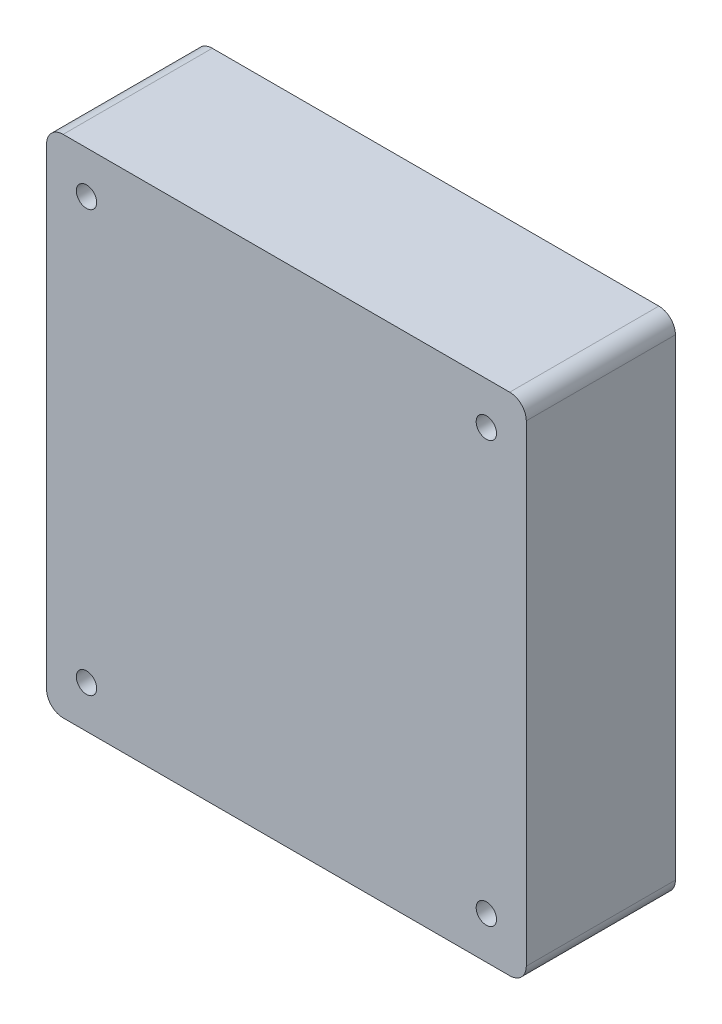
ISO-10303-21;
HEADER;
FILE_DESCRIPTION(('STEP AP214'),'2;1');
FILE_NAME('part.step','',(''),(''),'','','');
FILE_SCHEMA(('AUTOMOTIVE_DESIGN { 1 0 10303 214 1 1 1 1 }'));
ENDSEC;
DATA;
#1=APPLICATION_CONTEXT('core data for automotive mechanical design processes');
#2=APPLICATION_PROTOCOL_DEFINITION('international standard','automotive_design',2000,#1);
#3=PRODUCT_CONTEXT('',#1,'mechanical');
#4=PRODUCT('Part','Part','',(#3));
#5=PRODUCT_RELATED_PRODUCT_CATEGORY('part','',(#4));
#6=PRODUCT_DEFINITION_FORMATION('','',#4);
#7=PRODUCT_DEFINITION_CONTEXT('part definition',#1,'design');
#8=PRODUCT_DEFINITION('design','',#6,#7);
#9=PRODUCT_DEFINITION_SHAPE('','',#8);
#10=(LENGTH_UNIT() NAMED_UNIT(*) SI_UNIT(.MILLI.,.METRE.));
#11=(NAMED_UNIT(*) PLANE_ANGLE_UNIT() SI_UNIT($,.RADIAN.));
#12=(NAMED_UNIT(*) SI_UNIT($,.STERADIAN.) SOLID_ANGLE_UNIT());
#13=UNCERTAINTY_MEASURE_WITH_UNIT(LENGTH_MEASURE(1.E-05),#10,'distance_accuracy_value','');
#14=(GEOMETRIC_REPRESENTATION_CONTEXT(3) GLOBAL_UNCERTAINTY_ASSIGNED_CONTEXT((#13)) GLOBAL_UNIT_ASSIGNED_CONTEXT((#10,
#11,#12)) REPRESENTATION_CONTEXT('',''));
#15=CARTESIAN_POINT('',(0.,0.,0.));
#16=DIRECTION('',(0.,0.,1.));
#17=DIRECTION('',(1.,0.,0.));
#18=AXIS2_PLACEMENT_3D('',#15,#16,#17);
#19=CARTESIAN_POINT('',(28.95,30.5,18.));
#20=DIRECTION('',(0.,0.,1.));
#21=DIRECTION('',(1.,0.,0.));
#22=AXIS2_PLACEMENT_3D('',#19,#20,#21);
#23=PLANE('',#22);
#24=CARTESIAN_POINT('',(4.82,5.1,18.));
#25=DIRECTION('',(0.,0.,1.));
#26=DIRECTION('',(1.,0.,0.));
#27=AXIS2_PLACEMENT_3D('',#24,#25,#26);
#28=CIRCLE('',#27,1.2295);
#29=CARTESIAN_POINT('',(6.0495,5.1,18.));
#30=VERTEX_POINT('',#29);
#31=EDGE_CURVE('E137',#30,#30,#28,.F.);
#32=ORIENTED_EDGE('',*,*,#31,.T.);
#33=EDGE_LOOP('',(#32));
#34=FACE_BOUND('',#33,.T.);
#35=CARTESIAN_POINT('',(4.81999999999999,55.9,18.));
#36=DIRECTION('',(0.,0.,1.));
#37=DIRECTION('',(1.,0.,0.));
#38=AXIS2_PLACEMENT_3D('',#35,#36,#37);
#39=CIRCLE('',#38,1.2295);
#40=CARTESIAN_POINT('',(6.04949999999999,55.9,18.));
#41=VERTEX_POINT('',#40);
#42=EDGE_CURVE('E140',#41,#41,#39,.F.);
#43=ORIENTED_EDGE('',*,*,#42,.T.);
#44=EDGE_LOOP('',(#43));
#45=FACE_BOUND('',#44,.T.);
#46=CARTESIAN_POINT('',(53.08,5.1,18.));
#47=DIRECTION('',(0.,0.,1.));
#48=DIRECTION('',(1.,0.,0.));
#49=AXIS2_PLACEMENT_3D('',#46,#47,#48);
#50=CIRCLE('',#49,1.2295);
#51=CARTESIAN_POINT('',(54.3095,5.1,18.));
#52=VERTEX_POINT('',#51);
#53=EDGE_CURVE('E143',#52,#52,#50,.F.);
#54=ORIENTED_EDGE('',*,*,#53,.T.);
#55=EDGE_LOOP('',(#54));
#56=FACE_BOUND('',#55,.T.);
#57=CARTESIAN_POINT('',(53.08,55.9,18.));
#58=DIRECTION('',(0.,0.,1.));
#59=DIRECTION('',(1.,0.,0.));
#60=AXIS2_PLACEMENT_3D('',#57,#58,#59);
#61=CIRCLE('',#60,1.2295);
#62=CARTESIAN_POINT('',(54.3095,55.9,18.));
#63=VERTEX_POINT('',#62);
#64=EDGE_CURVE('E146',#63,#63,#61,.F.);
#65=ORIENTED_EDGE('',*,*,#64,.T.);
#66=EDGE_LOOP('',(#65));
#67=FACE_BOUND('',#66,.T.);
#68=CARTESIAN_POINT('',(55.9,2.,18.));
#69=DIRECTION('',(0.,0.,1.));
#70=DIRECTION('',(1.,0.,0.));
#71=AXIS2_PLACEMENT_3D('',#68,#69,#70);
#72=CIRCLE('',#71,2.);
#73=CARTESIAN_POINT('',(57.9,2.,18.));
#74=VERTEX_POINT('',#73);
#75=CARTESIAN_POINT('',(55.9,0.,18.));
#76=VERTEX_POINT('',#75);
#77=EDGE_CURVE('E151',#74,#76,#72,.F.);
#78=ORIENTED_EDGE('',*,*,#77,.F.);
#79=DIRECTION('',(0.,1.,0.));
#80=VECTOR('',#79,1.);
#81=CARTESIAN_POINT('',(57.9,61.,18.));
#82=LINE('',#81,#80);
#83=CARTESIAN_POINT('',(57.9,59.,18.));
#84=VERTEX_POINT('',#83);
#85=EDGE_CURVE('E106',#84,#74,#82,.F.);
#86=ORIENTED_EDGE('',*,*,#85,.F.);
#87=CARTESIAN_POINT('',(55.9,59.,18.));
#88=DIRECTION('',(0.,0.,1.));
#89=DIRECTION('',(1.,0.,0.));
#90=AXIS2_PLACEMENT_3D('',#87,#88,#89);
#91=CIRCLE('',#90,2.);
#92=CARTESIAN_POINT('',(55.9,61.,18.));
#93=VERTEX_POINT('',#92);
#94=EDGE_CURVE('E93',#93,#84,#91,.F.);
#95=ORIENTED_EDGE('',*,*,#94,.F.);
#96=DIRECTION('',(1.,0.,0.));
#97=VECTOR('',#96,1.);
#98=CARTESIAN_POINT('',(0.,61.,18.));
#99=LINE('',#98,#97);
#100=CARTESIAN_POINT('',(1.99999999999998,61.,18.));
#101=VERTEX_POINT('',#100);
#102=EDGE_CURVE('E89',#101,#93,#99,.T.);
#103=ORIENTED_EDGE('',*,*,#102,.F.);
#104=CARTESIAN_POINT('',(1.99999999999998,59.,18.));
#105=DIRECTION('',(0.,0.,1.));
#106=DIRECTION('',(1.,0.,0.));
#107=AXIS2_PLACEMENT_3D('',#104,#105,#106);
#108=CIRCLE('',#107,2.);
#109=CARTESIAN_POINT('',(0.,59.,18.));
#110=VERTEX_POINT('',#109);
#111=EDGE_CURVE('E20',#110,#101,#108,.F.);
#112=ORIENTED_EDGE('',*,*,#111,.F.);
#113=DIRECTION('',(0.,1.,0.));
#114=VECTOR('',#113,1.);
#115=CARTESIAN_POINT('',(0.,0.,18.));
#116=LINE('',#115,#114);
#117=CARTESIAN_POINT('',(0.,2.,18.));
#118=VERTEX_POINT('',#117);
#119=EDGE_CURVE('E102',#118,#110,#116,.T.);
#120=ORIENTED_EDGE('',*,*,#119,.F.);
#121=CARTESIAN_POINT('',(2.,2.,18.));
#122=DIRECTION('',(0.,0.,1.));
#123=DIRECTION('',(1.,0.,0.));
#124=AXIS2_PLACEMENT_3D('',#121,#122,#123);
#125=CIRCLE('',#124,2.);
#126=CARTESIAN_POINT('',(2.,0.,18.));
#127=VERTEX_POINT('',#126);
#128=EDGE_CURVE('E114',#127,#118,#125,.F.);
#129=ORIENTED_EDGE('',*,*,#128,.F.);
#130=DIRECTION('',(1.,0.,0.));
#131=VECTOR('',#130,1.);
#132=CARTESIAN_POINT('',(57.9,0.,18.));
#133=LINE('',#132,#131);
#134=EDGE_CURVE('E110',#76,#127,#133,.F.);
#135=ORIENTED_EDGE('',*,*,#134,.F.);
#136=EDGE_LOOP('',(#78,#86,#95,#103,#112,#120,#129,#135));
#137=FACE_BOUND('',#136,.T.);
#138=ADVANCED_FACE('F17',(#34,#45,#56,#67,#137),#23,.T.);
#139=CARTESIAN_POINT('',(0.,61.,0.));
#140=DIRECTION('',(0.,1.,0.));
#141=DIRECTION('',(0.,0.,1.));
#142=AXIS2_PLACEMENT_3D('',#139,#140,#141);
#143=PLANE('',#142);
#144=DIRECTION('',(0.,0.,1.));
#145=VECTOR('',#144,1.);
#146=CARTESIAN_POINT('',(1.99999999999998,61.,0.));
#147=LINE('',#146,#145);
#148=CARTESIAN_POINT('',(1.99999999999998,61.,0.));
#149=VERTEX_POINT('',#148);
#150=EDGE_CURVE('E86',#101,#149,#147,.F.);
#151=ORIENTED_EDGE('',*,*,#150,.F.);
#152=ORIENTED_EDGE('',*,*,#102,.T.);
#153=DIRECTION('',(0.,0.,1.));
#154=VECTOR('',#153,1.);
#155=CARTESIAN_POINT('',(55.9,61.,0.));
#156=LINE('',#155,#154);
#157=CARTESIAN_POINT('',(55.9,61.,0.));
#158=VERTEX_POINT('',#157);
#159=EDGE_CURVE('E149',#158,#93,#156,.T.);
#160=ORIENTED_EDGE('',*,*,#159,.F.);
#161=DIRECTION('',(1.,0.,0.));
#162=VECTOR('',#161,1.);
#163=CARTESIAN_POINT('',(28.95,61.,0.));
#164=LINE('',#163,#162);
#165=EDGE_CURVE('E100',#158,#149,#164,.F.);
#166=ORIENTED_EDGE('',*,*,#165,.T.);
#167=EDGE_LOOP('',(#151,#152,#160,#166));
#168=FACE_BOUND('',#167,.T.);
#169=ADVANCED_FACE('F99',(#168),#143,.T.);
#170=CARTESIAN_POINT('',(1.99999999999998,59.,0.));
#171=DIRECTION('',(0.,0.,1.));
#172=DIRECTION('',(1.,0.,0.));
#173=AXIS2_PLACEMENT_3D('',#170,#171,#172);
#174=CYLINDRICAL_SURFACE('',#173,2.);
#175=CARTESIAN_POINT('',(1.99999999999998,59.,0.));
#176=DIRECTION('',(0.,0.,1.));
#177=DIRECTION('',(1.,0.,0.));
#178=AXIS2_PLACEMENT_3D('',#175,#176,#177);
#179=CIRCLE('',#178,2.);
#180=CARTESIAN_POINT('',(0.,59.,0.));
#181=VERTEX_POINT('',#180);
#182=EDGE_CURVE('E135',#149,#181,#179,.T.);
#183=ORIENTED_EDGE('',*,*,#182,.T.);
#184=DIRECTION('',(0.,0.,1.));
#185=VECTOR('',#184,1.);
#186=CARTESIAN_POINT('',(0.,59.,0.));
#187=LINE('',#186,#185);
#188=EDGE_CURVE('E88',#110,#181,#187,.F.);
#189=ORIENTED_EDGE('',*,*,#188,.F.);
#190=ORIENTED_EDGE('',*,*,#111,.T.);
#191=ORIENTED_EDGE('',*,*,#150,.T.);
#192=EDGE_LOOP('',(#183,#189,#190,#191));
#193=FACE_BOUND('',#192,.T.);
#194=ADVANCED_FACE('F84',(#193),#174,.T.);
#195=CARTESIAN_POINT('',(0.,0.,0.));
#196=DIRECTION('',(-1.,0.,0.));
#197=DIRECTION('',(0.,0.,1.));
#198=AXIS2_PLACEMENT_3D('',#195,#196,#197);
#199=PLANE('',#198);
#200=DIRECTION('',(0.,0.,1.));
#201=VECTOR('',#200,1.);
#202=CARTESIAN_POINT('',(0.,2.,0.));
#203=LINE('',#202,#201);
#204=CARTESIAN_POINT('',(0.,2.,0.));
#205=VERTEX_POINT('',#204);
#206=EDGE_CURVE('E113',#118,#205,#203,.F.);
#207=ORIENTED_EDGE('',*,*,#206,.F.);
#208=ORIENTED_EDGE('',*,*,#119,.T.);
#209=ORIENTED_EDGE('',*,*,#188,.T.);
#210=DIRECTION('',(0.,1.,0.));
#211=VECTOR('',#210,1.);
#212=CARTESIAN_POINT('',(0.,30.5,0.));
#213=LINE('',#212,#211);
#214=EDGE_CURVE('E134',#181,#205,#213,.F.);
#215=ORIENTED_EDGE('',*,*,#214,.T.);
#216=EDGE_LOOP('',(#207,#208,#209,#215));
#217=FACE_BOUND('',#216,.T.);
#218=ADVANCED_FACE('F186',(#217),#199,.T.);
#219=CARTESIAN_POINT('',(2.,2.,0.));
#220=DIRECTION('',(0.,0.,1.));
#221=DIRECTION('',(1.,0.,0.));
#222=AXIS2_PLACEMENT_3D('',#219,#220,#221);
#223=CYLINDRICAL_SURFACE('',#222,2.);
#224=CARTESIAN_POINT('',(2.,2.,0.));
#225=DIRECTION('',(0.,0.,1.));
#226=DIRECTION('',(1.,0.,0.));
#227=AXIS2_PLACEMENT_3D('',#224,#225,#226);
#228=CIRCLE('',#227,2.);
#229=CARTESIAN_POINT('',(2.,0.,0.));
#230=VERTEX_POINT('',#229);
#231=EDGE_CURVE('E131',#205,#230,#228,.T.);
#232=ORIENTED_EDGE('',*,*,#231,.T.);
#233=DIRECTION('',(0.,0.,-1.));
#234=VECTOR('',#233,1.);
#235=CARTESIAN_POINT('',(2.,0.,0.));
#236=LINE('',#235,#234);
#237=EDGE_CURVE('E112',#127,#230,#236,.T.);
#238=ORIENTED_EDGE('',*,*,#237,.F.);
#239=ORIENTED_EDGE('',*,*,#128,.T.);
#240=ORIENTED_EDGE('',*,*,#206,.T.);
#241=EDGE_LOOP('',(#232,#238,#239,#240));
#242=FACE_BOUND('',#241,.T.);
#243=ADVANCED_FACE('F184',(#242),#223,.T.);
#244=CARTESIAN_POINT('',(57.9,0.,0.));
#245=DIRECTION('',(0.,-1.,0.));
#246=DIRECTION('',(0.,0.,-1.));
#247=AXIS2_PLACEMENT_3D('',#244,#245,#246);
#248=PLANE('',#247);
#249=ORIENTED_EDGE('',*,*,#237,.T.);
#250=DIRECTION('',(1.,0.,0.));
#251=VECTOR('',#250,1.);
#252=CARTESIAN_POINT('',(28.95,0.,0.));
#253=LINE('',#252,#251);
#254=CARTESIAN_POINT('',(55.9,0.,0.));
#255=VERTEX_POINT('',#254);
#256=EDGE_CURVE('E130',#230,#255,#253,.T.);
#257=ORIENTED_EDGE('',*,*,#256,.T.);
#258=DIRECTION('',(0.,0.,1.));
#259=VECTOR('',#258,1.);
#260=CARTESIAN_POINT('',(55.9,0.,0.));
#261=LINE('',#260,#259);
#262=EDGE_CURVE('E109',#76,#255,#261,.F.);
#263=ORIENTED_EDGE('',*,*,#262,.F.);
#264=ORIENTED_EDGE('',*,*,#134,.T.);
#265=EDGE_LOOP('',(#249,#257,#263,#264));
#266=FACE_BOUND('',#265,.T.);
#267=ADVANCED_FACE('F182',(#266),#248,.T.);
#268=CARTESIAN_POINT('',(55.9,2.,0.));
#269=DIRECTION('',(0.,0.,1.));
#270=DIRECTION('',(1.,0.,0.));
#271=AXIS2_PLACEMENT_3D('',#268,#269,#270);
#272=CYLINDRICAL_SURFACE('',#271,2.);
#273=CARTESIAN_POINT('',(55.9,2.,0.));
#274=DIRECTION('',(0.,0.,1.));
#275=DIRECTION('',(1.,0.,0.));
#276=AXIS2_PLACEMENT_3D('',#273,#274,#275);
#277=CIRCLE('',#276,2.);
#278=CARTESIAN_POINT('',(57.9,2.,0.));
#279=VERTEX_POINT('',#278);
#280=EDGE_CURVE('E127',#255,#279,#277,.T.);
#281=ORIENTED_EDGE('',*,*,#280,.T.);
#282=DIRECTION('',(0.,0.,-1.));
#283=VECTOR('',#282,1.);
#284=CARTESIAN_POINT('',(57.9,2.,0.));
#285=LINE('',#284,#283);
#286=EDGE_CURVE('E108',#74,#279,#285,.T.);
#287=ORIENTED_EDGE('',*,*,#286,.F.);
#288=ORIENTED_EDGE('',*,*,#77,.T.);
#289=ORIENTED_EDGE('',*,*,#262,.T.);
#290=EDGE_LOOP('',(#281,#287,#288,#289));
#291=FACE_BOUND('',#290,.T.);
#292=ADVANCED_FACE('F178',(#291),#272,.T.);
#293=CARTESIAN_POINT('',(57.9,61.,0.));
#294=DIRECTION('',(1.,0.,0.));
#295=DIRECTION('',(0.,0.,-1.));
#296=AXIS2_PLACEMENT_3D('',#293,#294,#295);
#297=PLANE('',#296);
#298=ORIENTED_EDGE('',*,*,#286,.T.);
#299=DIRECTION('',(0.,1.,0.));
#300=VECTOR('',#299,1.);
#301=CARTESIAN_POINT('',(57.9,30.5,0.));
#302=LINE('',#301,#300);
#303=CARTESIAN_POINT('',(57.9,59.,0.));
#304=VERTEX_POINT('',#303);
#305=EDGE_CURVE('E126',#279,#304,#302,.T.);
#306=ORIENTED_EDGE('',*,*,#305,.T.);
#307=DIRECTION('',(0.,0.,1.));
#308=VECTOR('',#307,1.);
#309=CARTESIAN_POINT('',(57.9,59.,0.));
#310=LINE('',#309,#308);
#311=EDGE_CURVE('E35',#84,#304,#310,.F.);
#312=ORIENTED_EDGE('',*,*,#311,.F.);
#313=ORIENTED_EDGE('',*,*,#85,.T.);
#314=EDGE_LOOP('',(#298,#306,#312,#313));
#315=FACE_BOUND('',#314,.T.);
#316=ADVANCED_FACE('F171',(#315),#297,.T.);
#317=CARTESIAN_POINT('',(55.9,59.,0.));
#318=DIRECTION('',(0.,0.,1.));
#319=DIRECTION('',(1.,0.,0.));
#320=AXIS2_PLACEMENT_3D('',#317,#318,#319);
#321=CYLINDRICAL_SURFACE('',#320,2.);
#322=CARTESIAN_POINT('',(55.9,59.,0.));
#323=DIRECTION('',(0.,0.,1.));
#324=DIRECTION('',(1.,0.,0.));
#325=AXIS2_PLACEMENT_3D('',#322,#323,#324);
#326=CIRCLE('',#325,2.);
#327=EDGE_CURVE('E124',#304,#158,#326,.T.);
#328=ORIENTED_EDGE('',*,*,#327,.T.);
#329=ORIENTED_EDGE('',*,*,#159,.T.);
#330=ORIENTED_EDGE('',*,*,#94,.T.);
#331=ORIENTED_EDGE('',*,*,#311,.T.);
#332=EDGE_LOOP('',(#328,#329,#330,#331));
#333=FACE_BOUND('',#332,.T.);
#334=ADVANCED_FACE('F219',(#333),#321,.T.);
#335=CARTESIAN_POINT('',(53.08,55.9,-68.0081972837474));
#336=DIRECTION('',(0.,0.,1.));
#337=DIRECTION('',(1.,0.,0.));
#338=AXIS2_PLACEMENT_3D('',#335,#336,#337);
#339=CYLINDRICAL_SURFACE('',#338,1.2295);
#340=ORIENTED_EDGE('',*,*,#64,.F.);
#341=EDGE_LOOP('',(#340));
#342=FACE_BOUND('',#341,.T.);
#343=CARTESIAN_POINT('',(53.08,55.9,0.));
#344=DIRECTION('',(0.,0.,1.));
#345=DIRECTION('',(1.,0.,0.));
#346=AXIS2_PLACEMENT_3D('',#343,#344,#345);
#347=CIRCLE('',#346,1.2295);
#348=CARTESIAN_POINT('',(54.3095,55.9,0.));
#349=VERTEX_POINT('',#348);
#350=EDGE_CURVE('E121',#349,#349,#347,.F.);
#351=ORIENTED_EDGE('',*,*,#350,.T.);
#352=EDGE_LOOP('',(#351));
#353=FACE_BOUND('',#352,.T.);
#354=ADVANCED_FACE('F215',(#342,#353),#339,.F.);
#355=CARTESIAN_POINT('',(53.08,5.1,-68.0081972837474));
#356=DIRECTION('',(0.,0.,1.));
#357=DIRECTION('',(1.,0.,0.));
#358=AXIS2_PLACEMENT_3D('',#355,#356,#357);
#359=CYLINDRICAL_SURFACE('',#358,1.2295);
#360=ORIENTED_EDGE('',*,*,#53,.F.);
#361=EDGE_LOOP('',(#360));
#362=FACE_BOUND('',#361,.T.);
#363=CARTESIAN_POINT('',(53.08,5.1,0.));
#364=DIRECTION('',(0.,0.,1.));
#365=DIRECTION('',(1.,0.,0.));
#366=AXIS2_PLACEMENT_3D('',#363,#364,#365);
#367=CIRCLE('',#366,1.2295);
#368=CARTESIAN_POINT('',(54.3095,5.1,0.));
#369=VERTEX_POINT('',#368);
#370=EDGE_CURVE('E118',#369,#369,#367,.F.);
#371=ORIENTED_EDGE('',*,*,#370,.T.);
#372=EDGE_LOOP('',(#371));
#373=FACE_BOUND('',#372,.T.);
#374=ADVANCED_FACE('F211',(#362,#373),#359,.F.);
#375=CARTESIAN_POINT('',(4.81999999999999,55.9,-68.0081972837474));
#376=DIRECTION('',(0.,0.,1.));
#377=DIRECTION('',(1.,0.,0.));
#378=AXIS2_PLACEMENT_3D('',#375,#376,#377);
#379=CYLINDRICAL_SURFACE('',#378,1.2295);
#380=ORIENTED_EDGE('',*,*,#42,.F.);
#381=EDGE_LOOP('',(#380));
#382=FACE_BOUND('',#381,.T.);
#383=CARTESIAN_POINT('',(4.81999999999999,55.9,0.));
#384=DIRECTION('',(0.,0.,1.));
#385=DIRECTION('',(1.,0.,0.));
#386=AXIS2_PLACEMENT_3D('',#383,#384,#385);
#387=CIRCLE('',#386,1.2295);
#388=CARTESIAN_POINT('',(6.04949999999999,55.9,0.));
#389=VERTEX_POINT('',#388);
#390=EDGE_CURVE('E26',#389,#389,#387,.F.);
#391=ORIENTED_EDGE('',*,*,#390,.T.);
#392=EDGE_LOOP('',(#391));
#393=FACE_BOUND('',#392,.T.);
#394=ADVANCED_FACE('F203',(#382,#393),#379,.F.);
#395=CARTESIAN_POINT('',(4.82,5.1,-68.0081972837474));
#396=DIRECTION('',(0.,0.,1.));
#397=DIRECTION('',(1.,0.,0.));
#398=AXIS2_PLACEMENT_3D('',#395,#396,#397);
#399=CYLINDRICAL_SURFACE('',#398,1.2295);
#400=ORIENTED_EDGE('',*,*,#31,.F.);
#401=EDGE_LOOP('',(#400));
#402=FACE_BOUND('',#401,.T.);
#403=CARTESIAN_POINT('',(4.82,5.1,0.));
#404=DIRECTION('',(0.,0.,1.));
#405=DIRECTION('',(1.,0.,0.));
#406=AXIS2_PLACEMENT_3D('',#403,#404,#405);
#407=CIRCLE('',#406,1.2295);
#408=CARTESIAN_POINT('',(6.0495,5.1,0.));
#409=VERTEX_POINT('',#408);
#410=EDGE_CURVE('E11',#409,#409,#407,.F.);
#411=ORIENTED_EDGE('',*,*,#410,.T.);
#412=EDGE_LOOP('',(#411));
#413=FACE_BOUND('',#412,.T.);
#414=ADVANCED_FACE('F197',(#402,#413),#399,.F.);
#415=CARTESIAN_POINT('',(28.95,30.5,0.));
#416=DIRECTION('',(0.,0.,1.));
#417=DIRECTION('',(1.,0.,0.));
#418=AXIS2_PLACEMENT_3D('',#415,#416,#417);
#419=PLANE('',#418);
#420=ORIENTED_EDGE('',*,*,#410,.F.);
#421=EDGE_LOOP('',(#420));
#422=FACE_BOUND('',#421,.T.);
#423=ORIENTED_EDGE('',*,*,#390,.F.);
#424=EDGE_LOOP('',(#423));
#425=FACE_BOUND('',#424,.T.);
#426=ORIENTED_EDGE('',*,*,#370,.F.);
#427=EDGE_LOOP('',(#426));
#428=FACE_BOUND('',#427,.T.);
#429=ORIENTED_EDGE('',*,*,#350,.F.);
#430=EDGE_LOOP('',(#429));
#431=FACE_BOUND('',#430,.T.);
#432=ORIENTED_EDGE('',*,*,#305,.F.);
#433=ORIENTED_EDGE('',*,*,#280,.F.);
#434=ORIENTED_EDGE('',*,*,#256,.F.);
#435=ORIENTED_EDGE('',*,*,#231,.F.);
#436=ORIENTED_EDGE('',*,*,#214,.F.);
#437=ORIENTED_EDGE('',*,*,#182,.F.);
#438=ORIENTED_EDGE('',*,*,#165,.F.);
#439=ORIENTED_EDGE('',*,*,#327,.F.);
#440=EDGE_LOOP('',(#432,#433,#434,#435,#436,#437,#438,#439));
#441=FACE_BOUND('',#440,.T.);
#442=ADVANCED_FACE('F175',(#422,#425,#428,#431,#441),#419,.F.);
#443=CLOSED_SHELL('',(#138,#169,#194,#218,#243,#267,#292,#316,#334,#354,#374,#394,#414,#442));
#444=MANIFOLD_SOLID_BREP('B1',#443);
#445=ADVANCED_BREP_SHAPE_REPRESENTATION('',(#18,#444),#14);
#446=SHAPE_DEFINITION_REPRESENTATION(#9,#445);
ENDSEC;
END-ISO-10303-21;
